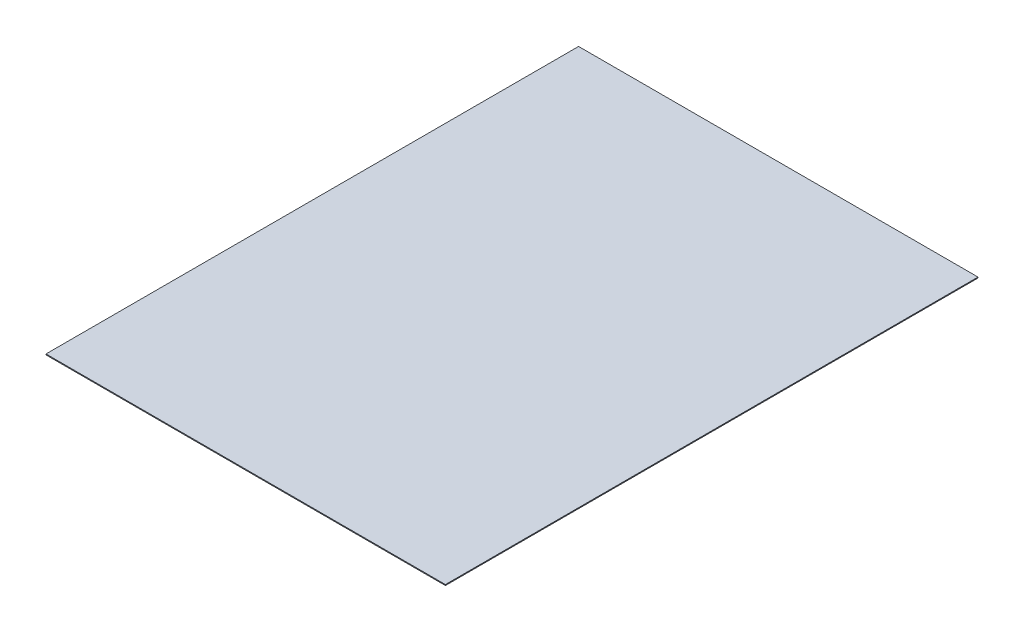
ISO-10303-21;
HEADER;
FILE_DESCRIPTION(('STEP AP214'),'2;1');
FILE_NAME('part.step','',(''),(''),'','','');
FILE_SCHEMA(('AUTOMOTIVE_DESIGN { 1 0 10303 214 1 1 1 1 }'));
ENDSEC;
DATA;
#1=APPLICATION_CONTEXT('core data for automotive mechanical design processes');
#2=APPLICATION_PROTOCOL_DEFINITION('international standard','automotive_design',2000,#1);
#3=PRODUCT_CONTEXT('',#1,'mechanical');
#4=PRODUCT('Part','Part','',(#3));
#5=PRODUCT_RELATED_PRODUCT_CATEGORY('part','',(#4));
#6=PRODUCT_DEFINITION_FORMATION('','',#4);
#7=PRODUCT_DEFINITION_CONTEXT('part definition',#1,'design');
#8=PRODUCT_DEFINITION('design','',#6,#7);
#9=PRODUCT_DEFINITION_SHAPE('','',#8);
#10=(LENGTH_UNIT() NAMED_UNIT(*) SI_UNIT(.MILLI.,.METRE.));
#11=(NAMED_UNIT(*) PLANE_ANGLE_UNIT() SI_UNIT($,.RADIAN.));
#12=(NAMED_UNIT(*) SI_UNIT($,.STERADIAN.) SOLID_ANGLE_UNIT());
#13=UNCERTAINTY_MEASURE_WITH_UNIT(LENGTH_MEASURE(1.E-05),#10,'distance_accuracy_value','');
#14=(GEOMETRIC_REPRESENTATION_CONTEXT(3) GLOBAL_UNCERTAINTY_ASSIGNED_CONTEXT((#13)) GLOBAL_UNIT_ASSIGNED_CONTEXT((#10,
#11,#12)) REPRESENTATION_CONTEXT('',''));
#15=CARTESIAN_POINT('',(0.,0.,0.));
#16=DIRECTION('',(0.,0.,1.));
#17=DIRECTION('',(1.,0.,0.));
#18=AXIS2_PLACEMENT_3D('',#15,#16,#17);
#19=CARTESIAN_POINT('',(855.604338842975,2.,-30.5888429752066));
#20=DIRECTION('',(-1.,0.,0.));
#21=DIRECTION('',(0.,0.,1.));
#22=AXIS2_PLACEMENT_3D('',#19,#20,#21);
#23=PLANE('',#22);
#24=DIRECTION('',(0.,0.,-1.));
#25=VECTOR('',#24,1.);
#26=CARTESIAN_POINT('',(855.604338842975,0.,-30.5888429752066));
#27=LINE('',#26,#25);
#28=CARTESIAN_POINT('',(855.604338842975,0.,1169.41115702479));
#29=VERTEX_POINT('',#28);
#30=CARTESIAN_POINT('',(855.604338842975,0.,-30.5888429752066));
#31=VERTEX_POINT('',#30);
#32=EDGE_CURVE('E111',#29,#31,#27,.T.);
#33=ORIENTED_EDGE('',*,*,#32,.T.);
#34=DIRECTION('',(0.,-1.,0.));
#35=VECTOR('',#34,1.);
#36=CARTESIAN_POINT('',(855.604338842975,2.,-30.5888429752066));
#37=LINE('',#36,#35);
#38=CARTESIAN_POINT('',(855.604338842975,2.,-30.5888429752066));
#39=VERTEX_POINT('',#38);
#40=EDGE_CURVE('E11',#39,#31,#37,.T.);
#41=ORIENTED_EDGE('',*,*,#40,.F.);
#42=DIRECTION('',(0.,0.,-1.));
#43=VECTOR('',#42,1.);
#44=CARTESIAN_POINT('',(855.604338842975,2.,-30.5888429752066));
#45=LINE('',#44,#43);
#46=CARTESIAN_POINT('',(855.604338842975,2.,1169.41115702479));
#47=VERTEX_POINT('',#46);
#48=EDGE_CURVE('E95',#47,#39,#45,.T.);
#49=ORIENTED_EDGE('',*,*,#48,.F.);
#50=DIRECTION('',(0.,-1.,0.));
#51=VECTOR('',#50,1.);
#52=CARTESIAN_POINT('',(855.604338842975,2.,1169.41115702479));
#53=LINE('',#52,#51);
#54=EDGE_CURVE('E107',#47,#29,#53,.T.);
#55=ORIENTED_EDGE('',*,*,#54,.T.);
#56=EDGE_LOOP('',(#33,#41,#49,#55));
#57=FACE_BOUND('',#56,.T.);
#58=ADVANCED_FACE('F43',(#57),#23,.F.);
#59=CARTESIAN_POINT('',(-44.3956611570248,2.,-30.5888429752066));
#60=DIRECTION('',(0.,0.,1.));
#61=DIRECTION('',(1.,0.,0.));
#62=AXIS2_PLACEMENT_3D('',#59,#60,#61);
#63=PLANE('',#62);
#64=DIRECTION('',(-1.,0.,0.));
#65=VECTOR('',#64,1.);
#66=CARTESIAN_POINT('',(-44.3956611570248,0.,-30.5888429752066));
#67=LINE('',#66,#65);
#68=CARTESIAN_POINT('',(-44.3956611570248,0.,-30.5888429752066));
#69=VERTEX_POINT('',#68);
#70=EDGE_CURVE('E100',#31,#69,#67,.T.);
#71=ORIENTED_EDGE('',*,*,#70,.T.);
#72=DIRECTION('',(0.,-1.,0.));
#73=VECTOR('',#72,1.);
#74=CARTESIAN_POINT('',(-44.3956611570248,2.,-30.5888429752066));
#75=LINE('',#74,#73);
#76=CARTESIAN_POINT('',(-44.3956611570248,2.,-30.5888429752066));
#77=VERTEX_POINT('',#76);
#78=EDGE_CURVE('E52',#77,#69,#75,.T.);
#79=ORIENTED_EDGE('',*,*,#78,.F.);
#80=DIRECTION('',(-1.,0.,0.));
#81=VECTOR('',#80,1.);
#82=CARTESIAN_POINT('',(-44.3956611570248,2.,-30.5888429752066));
#83=LINE('',#82,#81);
#84=EDGE_CURVE('E90',#39,#77,#83,.T.);
#85=ORIENTED_EDGE('',*,*,#84,.F.);
#86=ORIENTED_EDGE('',*,*,#40,.T.);
#87=EDGE_LOOP('',(#71,#79,#85,#86));
#88=FACE_BOUND('',#87,.T.);
#89=ADVANCED_FACE('F99',(#88),#63,.F.);
#90=CARTESIAN_POINT('',(-44.3956611570248,2.,-30.5888429752066));
#91=DIRECTION('',(1.,0.,0.));
#92=DIRECTION('',(0.,0.,-1.));
#93=AXIS2_PLACEMENT_3D('',#90,#91,#92);
#94=PLANE('',#93);
#95=DIRECTION('',(0.,0.,1.));
#96=VECTOR('',#95,1.);
#97=CARTESIAN_POINT('',(-44.3956611570248,0.,-30.5888429752066));
#98=LINE('',#97,#96);
#99=CARTESIAN_POINT('',(-44.3956611570246,0.,1169.41115702479));
#100=VERTEX_POINT('',#99);
#101=EDGE_CURVE('E77',#69,#100,#98,.T.);
#102=ORIENTED_EDGE('',*,*,#101,.T.);
#103=DIRECTION('',(0.,-1.,0.));
#104=VECTOR('',#103,1.);
#105=CARTESIAN_POINT('',(-44.3956611570246,2.,1169.41115702479));
#106=LINE('',#105,#104);
#107=CARTESIAN_POINT('',(-44.3956611570246,2.,1169.41115702479));
#108=VERTEX_POINT('',#107);
#109=EDGE_CURVE('E102',#108,#100,#106,.T.);
#110=ORIENTED_EDGE('',*,*,#109,.F.);
#111=DIRECTION('',(0.,0.,1.));
#112=VECTOR('',#111,1.);
#113=CARTESIAN_POINT('',(-44.3956611570248,2.,-30.5888429752066));
#114=LINE('',#113,#112);
#115=EDGE_CURVE('E93',#77,#108,#114,.T.);
#116=ORIENTED_EDGE('',*,*,#115,.F.);
#117=ORIENTED_EDGE('',*,*,#78,.T.);
#118=EDGE_LOOP('',(#102,#110,#116,#117));
#119=FACE_BOUND('',#118,.T.);
#120=ADVANCED_FACE('F103',(#119),#94,.F.);
#121=CARTESIAN_POINT('',(-44.3956611570246,2.,1169.41115702479));
#122=DIRECTION('',(0.,0.,-1.));
#123=DIRECTION('',(-1.,0.,0.));
#124=AXIS2_PLACEMENT_3D('',#121,#122,#123);
#125=PLANE('',#124);
#126=DIRECTION('',(1.,0.,0.));
#127=VECTOR('',#126,1.);
#128=CARTESIAN_POINT('',(-44.3956611570246,0.,1169.41115702479));
#129=LINE('',#128,#127);
#130=EDGE_CURVE('E83',#100,#29,#129,.T.);
#131=ORIENTED_EDGE('',*,*,#130,.T.);
#132=ORIENTED_EDGE('',*,*,#54,.F.);
#133=DIRECTION('',(1.,0.,0.));
#134=VECTOR('',#133,1.);
#135=CARTESIAN_POINT('',(-44.3956611570246,2.,1169.41115702479));
#136=LINE('',#135,#134);
#137=EDGE_CURVE('E60',#108,#47,#136,.T.);
#138=ORIENTED_EDGE('',*,*,#137,.F.);
#139=ORIENTED_EDGE('',*,*,#109,.T.);
#140=EDGE_LOOP('',(#131,#132,#138,#139));
#141=FACE_BOUND('',#140,.T.);
#142=ADVANCED_FACE('F124',(#141),#125,.F.);
#143=CARTESIAN_POINT('',(0.,2.,0.));
#144=DIRECTION('',(0.,1.,0.));
#145=DIRECTION('',(0.,0.,1.));
#146=AXIS2_PLACEMENT_3D('',#143,#144,#145);
#147=PLANE('',#146);
#148=ORIENTED_EDGE('',*,*,#48,.T.);
#149=ORIENTED_EDGE('',*,*,#84,.T.);
#150=ORIENTED_EDGE('',*,*,#115,.T.);
#151=ORIENTED_EDGE('',*,*,#137,.T.);
#152=EDGE_LOOP('',(#148,#149,#150,#151));
#153=FACE_BOUND('',#152,.T.);
#154=ADVANCED_FACE('F91',(#153),#147,.T.);
#155=CARTESIAN_POINT('',(0.,0.,0.));
#156=DIRECTION('',(0.,1.,0.));
#157=DIRECTION('',(0.,0.,1.));
#158=AXIS2_PLACEMENT_3D('',#155,#156,#157);
#159=PLANE('',#158);
#160=ORIENTED_EDGE('',*,*,#32,.F.);
#161=ORIENTED_EDGE('',*,*,#130,.F.);
#162=ORIENTED_EDGE('',*,*,#101,.F.);
#163=ORIENTED_EDGE('',*,*,#70,.F.);
#164=EDGE_LOOP('',(#160,#161,#162,#163));
#165=FACE_BOUND('',#164,.T.);
#166=ADVANCED_FACE('F127',(#165),#159,.F.);
#167=CLOSED_SHELL('',(#58,#89,#120,#142,#154,#166));
#168=MANIFOLD_SOLID_BREP('B2',#167);
#169=ADVANCED_BREP_SHAPE_REPRESENTATION('',(#18,#168),#14);
#170=SHAPE_DEFINITION_REPRESENTATION(#9,#169);
ENDSEC;
END-ISO-10303-21;
